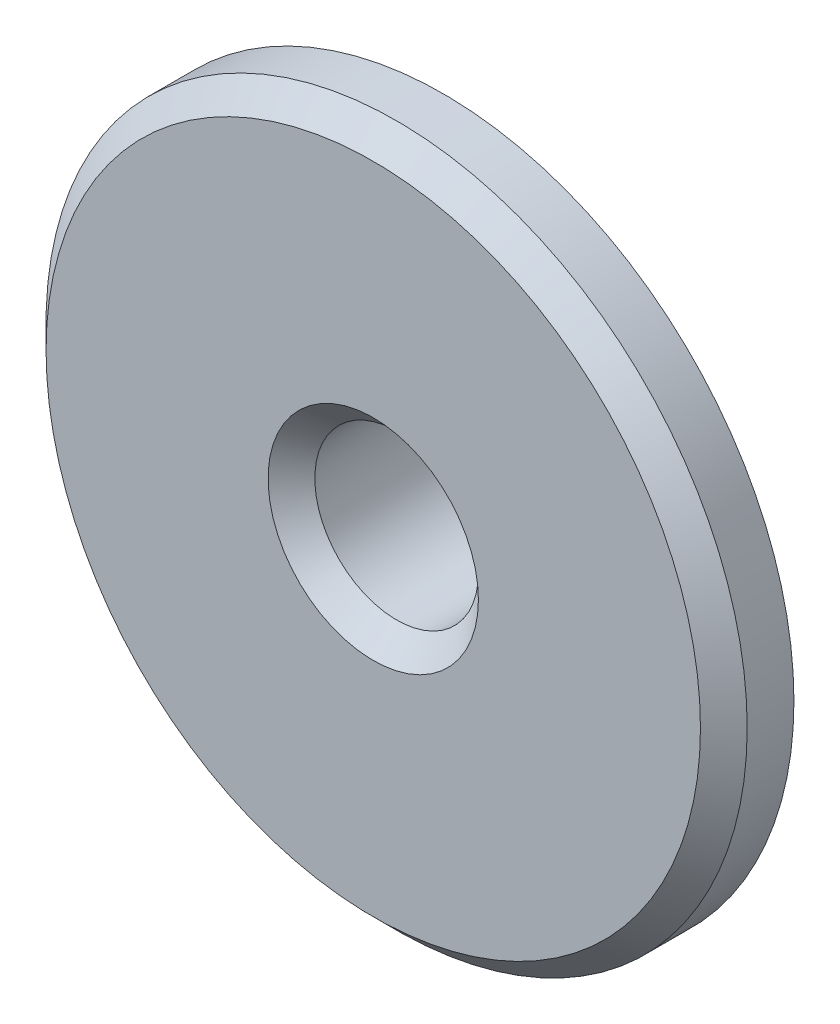
ISO-10303-21;
HEADER;
FILE_DESCRIPTION(('STEP AP214'),'2;1');
FILE_NAME('part.step','',(''),(''),'','','');
FILE_SCHEMA(('AUTOMOTIVE_DESIGN { 1 0 10303 214 1 1 1 1 }'));
ENDSEC;
DATA;
#1=APPLICATION_CONTEXT('core data for automotive mechanical design processes');
#2=APPLICATION_PROTOCOL_DEFINITION('international standard','automotive_design',2000,#1);
#3=PRODUCT_CONTEXT('',#1,'mechanical');
#4=PRODUCT('Part','Part','',(#3));
#5=PRODUCT_RELATED_PRODUCT_CATEGORY('part','',(#4));
#6=PRODUCT_DEFINITION_FORMATION('','',#4);
#7=PRODUCT_DEFINITION_CONTEXT('part definition',#1,'design');
#8=PRODUCT_DEFINITION('design','',#6,#7);
#9=PRODUCT_DEFINITION_SHAPE('','',#8);
#10=(LENGTH_UNIT() NAMED_UNIT(*) SI_UNIT(.MILLI.,.METRE.));
#11=(NAMED_UNIT(*) PLANE_ANGLE_UNIT() SI_UNIT($,.RADIAN.));
#12=(NAMED_UNIT(*) SI_UNIT($,.STERADIAN.) SOLID_ANGLE_UNIT());
#13=UNCERTAINTY_MEASURE_WITH_UNIT(LENGTH_MEASURE(1.E-05),#10,'distance_accuracy_value','');
#14=(GEOMETRIC_REPRESENTATION_CONTEXT(3) GLOBAL_UNCERTAINTY_ASSIGNED_CONTEXT((#13)) GLOBAL_UNIT_ASSIGNED_CONTEXT((#10,
#11,#12)) REPRESENTATION_CONTEXT('',''));
#15=CARTESIAN_POINT('',(0.,0.,0.));
#16=DIRECTION('',(0.,0.,1.));
#17=DIRECTION('',(1.,0.,0.));
#18=AXIS2_PLACEMENT_3D('',#15,#16,#17);
#19=CARTESIAN_POINT('',(0.,5.,-8.));
#20=DIRECTION('',(0.,0.,-1.));
#21=DIRECTION('',(-1.,0.,0.));
#22=AXIS2_PLACEMENT_3D('',#19,#20,#21);
#23=PLANE('',#22);
#24=CARTESIAN_POINT('',(0.,0.,-8.));
#25=DIRECTION('',(0.,0.,-1.));
#26=DIRECTION('',(-1.,0.,0.));
#27=AXIS2_PLACEMENT_3D('',#24,#25,#26);
#28=CIRCLE('',#27,3.99999999999999);
#29=CARTESIAN_POINT('',(-3.99999999999999,0.,-8.));
#30=VERTEX_POINT('',#29);
#31=EDGE_CURVE('E53',#30,#30,#28,.T.);
#32=ORIENTED_EDGE('',*,*,#31,.T.);
#33=EDGE_LOOP('',(#32));
#34=FACE_BOUND('',#33,.T.);
#35=CARTESIAN_POINT('',(0.,0.,-8.));
#36=DIRECTION('',(0.,0.,1.));
#37=DIRECTION('',(1.,0.,0.));
#38=AXIS2_PLACEMENT_3D('',#35,#36,#37);
#39=CIRCLE('',#38,3.5);
#40=CARTESIAN_POINT('',(3.5,0.,-8.));
#41=VERTEX_POINT('',#40);
#42=EDGE_CURVE('E59',#41,#41,#39,.T.);
#43=ORIENTED_EDGE('',*,*,#42,.T.);
#44=EDGE_LOOP('',(#43));
#45=FACE_BOUND('',#44,.T.);
#46=ADVANCED_FACE('F33',(#34,#45),#23,.T.);
#47=CARTESIAN_POINT('',(0.,0.,0.));
#48=DIRECTION('',(0.,0.,1.));
#49=DIRECTION('',(1.,0.,0.));
#50=AXIS2_PLACEMENT_3D('',#47,#48,#49);
#51=CYLINDRICAL_SURFACE('',#50,3.5);
#52=CARTESIAN_POINT('',(0.,0.,-1.00000000000001));
#53=DIRECTION('',(0.,0.,1.));
#54=DIRECTION('',(1.,0.,0.));
#55=AXIS2_PLACEMENT_3D('',#52,#53,#54);
#56=CIRCLE('',#55,3.5);
#57=CARTESIAN_POINT('',(3.5,0.,-1.00000000000001));
#58=VERTEX_POINT('',#57);
#59=EDGE_CURVE('E48',#58,#58,#56,.T.);
#60=ORIENTED_EDGE('',*,*,#59,.T.);
#61=EDGE_LOOP('',(#60));
#62=FACE_BOUND('',#61,.T.);
#63=ORIENTED_EDGE('',*,*,#42,.F.);
#64=EDGE_LOOP('',(#63));
#65=FACE_BOUND('',#64,.T.);
#66=ADVANCED_FACE('F87',(#62,#65),#51,.F.);
#67=CARTESIAN_POINT('',(0.,3.5,0.));
#68=DIRECTION('',(0.,0.,1.));
#69=DIRECTION('',(1.,0.,0.));
#70=AXIS2_PLACEMENT_3D('',#67,#68,#69);
#71=PLANE('',#70);
#72=CARTESIAN_POINT('',(0.,0.,0.));
#73=DIRECTION('',(0.,0.,1.));
#74=DIRECTION('',(1.,0.,0.));
#75=AXIS2_PLACEMENT_3D('',#72,#73,#74);
#76=CIRCLE('',#75,4.50000000000001);
#77=CARTESIAN_POINT('',(4.50000000000001,0.,0.));
#78=VERTEX_POINT('',#77);
#79=EDGE_CURVE('E40',#78,#78,#76,.F.);
#80=ORIENTED_EDGE('',*,*,#79,.T.);
#81=EDGE_LOOP('',(#80));
#82=FACE_BOUND('',#81,.T.);
#83=CARTESIAN_POINT('',(0.,0.,0.));
#84=DIRECTION('',(0.,0.,1.));
#85=DIRECTION('',(1.,0.,0.));
#86=AXIS2_PLACEMENT_3D('',#83,#84,#85);
#87=CIRCLE('',#86,14.);
#88=CARTESIAN_POINT('',(14.,0.,0.));
#89=VERTEX_POINT('',#88);
#90=EDGE_CURVE('E44',#89,#89,#87,.T.);
#91=ORIENTED_EDGE('',*,*,#90,.T.);
#92=EDGE_LOOP('',(#91));
#93=FACE_BOUND('',#92,.T.);
#94=ADVANCED_FACE('F93',(#82,#93),#71,.T.);
#95=CARTESIAN_POINT('',(0.,0.,0.));
#96=DIRECTION('',(0.,0.,1.));
#97=DIRECTION('',(1.,0.,0.));
#98=AXIS2_PLACEMENT_3D('',#95,#96,#97);
#99=CYLINDRICAL_SURFACE('',#98,15.);
#100=CARTESIAN_POINT('',(0.,0.,-0.999999999999997));
#101=DIRECTION('',(0.,0.,1.));
#102=DIRECTION('',(1.,0.,0.));
#103=AXIS2_PLACEMENT_3D('',#100,#101,#102);
#104=CIRCLE('',#103,15.);
#105=CARTESIAN_POINT('',(15.,0.,-0.999999999999997));
#106=VERTEX_POINT('',#105);
#107=EDGE_CURVE('E10',#106,#106,#104,.F.);
#108=ORIENTED_EDGE('',*,*,#107,.T.);
#109=EDGE_LOOP('',(#108));
#110=FACE_BOUND('',#109,.T.);
#111=CARTESIAN_POINT('',(0.,0.,-3.));
#112=DIRECTION('',(0.,0.,1.));
#113=DIRECTION('',(1.,0.,0.));
#114=AXIS2_PLACEMENT_3D('',#111,#112,#113);
#115=CIRCLE('',#114,15.);
#116=CARTESIAN_POINT('',(15.,0.,-3.));
#117=VERTEX_POINT('',#116);
#118=EDGE_CURVE('E62',#117,#117,#115,.T.);
#119=ORIENTED_EDGE('',*,*,#118,.T.);
#120=EDGE_LOOP('',(#119));
#121=FACE_BOUND('',#120,.T.);
#122=ADVANCED_FACE('F84',(#110,#121),#99,.T.);
#123=CARTESIAN_POINT('',(0.,15.,-3.));
#124=DIRECTION('',(0.,0.,-1.));
#125=DIRECTION('',(-1.,0.,0.));
#126=AXIS2_PLACEMENT_3D('',#123,#124,#125);
#127=PLANE('',#126);
#128=CARTESIAN_POINT('',(0.,0.,-3.));
#129=DIRECTION('',(0.,0.,1.));
#130=DIRECTION('',(1.,0.,0.));
#131=AXIS2_PLACEMENT_3D('',#128,#129,#130);
#132=CIRCLE('',#131,5.);
#133=CARTESIAN_POINT('',(5.,0.,-3.));
#134=VERTEX_POINT('',#133);
#135=EDGE_CURVE('E65',#134,#134,#132,.T.);
#136=ORIENTED_EDGE('',*,*,#135,.T.);
#137=EDGE_LOOP('',(#136));
#138=FACE_BOUND('',#137,.T.);
#139=ORIENTED_EDGE('',*,*,#118,.F.);
#140=EDGE_LOOP('',(#139));
#141=FACE_BOUND('',#140,.T.);
#142=ADVANCED_FACE('F69',(#138,#141),#127,.T.);
#143=CARTESIAN_POINT('',(0.,0.,0.));
#144=DIRECTION('',(0.,0.,1.));
#145=DIRECTION('',(1.,0.,0.));
#146=AXIS2_PLACEMENT_3D('',#143,#144,#145);
#147=CYLINDRICAL_SURFACE('',#146,5.);
#148=CARTESIAN_POINT('',(0.,0.,-6.99999999999999));
#149=DIRECTION('',(0.,0.,-1.));
#150=DIRECTION('',(-1.,0.,0.));
#151=AXIS2_PLACEMENT_3D('',#148,#149,#150);
#152=CIRCLE('',#151,5.);
#153=CARTESIAN_POINT('',(-5.,0.,-6.99999999999999));
#154=VERTEX_POINT('',#153);
#155=EDGE_CURVE('E56',#154,#154,#152,.F.);
#156=ORIENTED_EDGE('',*,*,#155,.T.);
#157=EDGE_LOOP('',(#156));
#158=FACE_BOUND('',#157,.T.);
#159=ORIENTED_EDGE('',*,*,#135,.F.);
#160=EDGE_LOOP('',(#159));
#161=FACE_BOUND('',#160,.T.);
#162=ADVANCED_FACE('F72',(#158,#161),#147,.T.);
#163=CARTESIAN_POINT('',(0.,0.,-6.99999999999999));
#164=DIRECTION('',(0.,0.,1.));
#165=DIRECTION('',(1.,0.,0.));
#166=AXIS2_PLACEMENT_3D('',#163,#164,#165);
#167=CONICAL_SURFACE('',#166,5.,0.78539816339745);
#168=ORIENTED_EDGE('',*,*,#31,.F.);
#169=EDGE_LOOP('',(#168));
#170=FACE_BOUND('',#169,.T.);
#171=ORIENTED_EDGE('',*,*,#155,.F.);
#172=EDGE_LOOP('',(#171));
#173=FACE_BOUND('',#172,.T.);
#174=ADVANCED_FACE('F74',(#170,#173),#167,.T.);
#175=CARTESIAN_POINT('',(0.,0.,-1.00000000000001));
#176=DIRECTION('',(0.,0.,1.));
#177=DIRECTION('',(1.,0.,0.));
#178=AXIS2_PLACEMENT_3D('',#175,#176,#177);
#179=CONICAL_SURFACE('',#178,3.5,0.785398163397449);
#180=ORIENTED_EDGE('',*,*,#79,.F.);
#181=EDGE_LOOP('',(#180));
#182=FACE_BOUND('',#181,.T.);
#183=ORIENTED_EDGE('',*,*,#59,.F.);
#184=EDGE_LOOP('',(#183));
#185=FACE_BOUND('',#184,.T.);
#186=ADVANCED_FACE('F81',(#182,#185),#179,.F.);
#187=CARTESIAN_POINT('',(0.,0.,0.));
#188=DIRECTION('',(0.,0.,-1.));
#189=DIRECTION('',(-1.,0.,0.));
#190=AXIS2_PLACEMENT_3D('',#187,#188,#189);
#191=CONICAL_SURFACE('',#190,14.,0.785398163397447);
#192=ORIENTED_EDGE('',*,*,#107,.F.);
#193=EDGE_LOOP('',(#192));
#194=FACE_BOUND('',#193,.T.);
#195=ORIENTED_EDGE('',*,*,#90,.F.);
#196=EDGE_LOOP('',(#195));
#197=FACE_BOUND('',#196,.T.);
#198=ADVANCED_FACE('F35',(#194,#197),#191,.T.);
#199=CLOSED_SHELL('',(#46,#66,#94,#122,#142,#162,#174,#186,#198));
#200=MANIFOLD_SOLID_BREP('B2',#199);
#201=ADVANCED_BREP_SHAPE_REPRESENTATION('',(#18,#200),#14);
#202=SHAPE_DEFINITION_REPRESENTATION(#9,#201);
ENDSEC;
END-ISO-10303-21;
